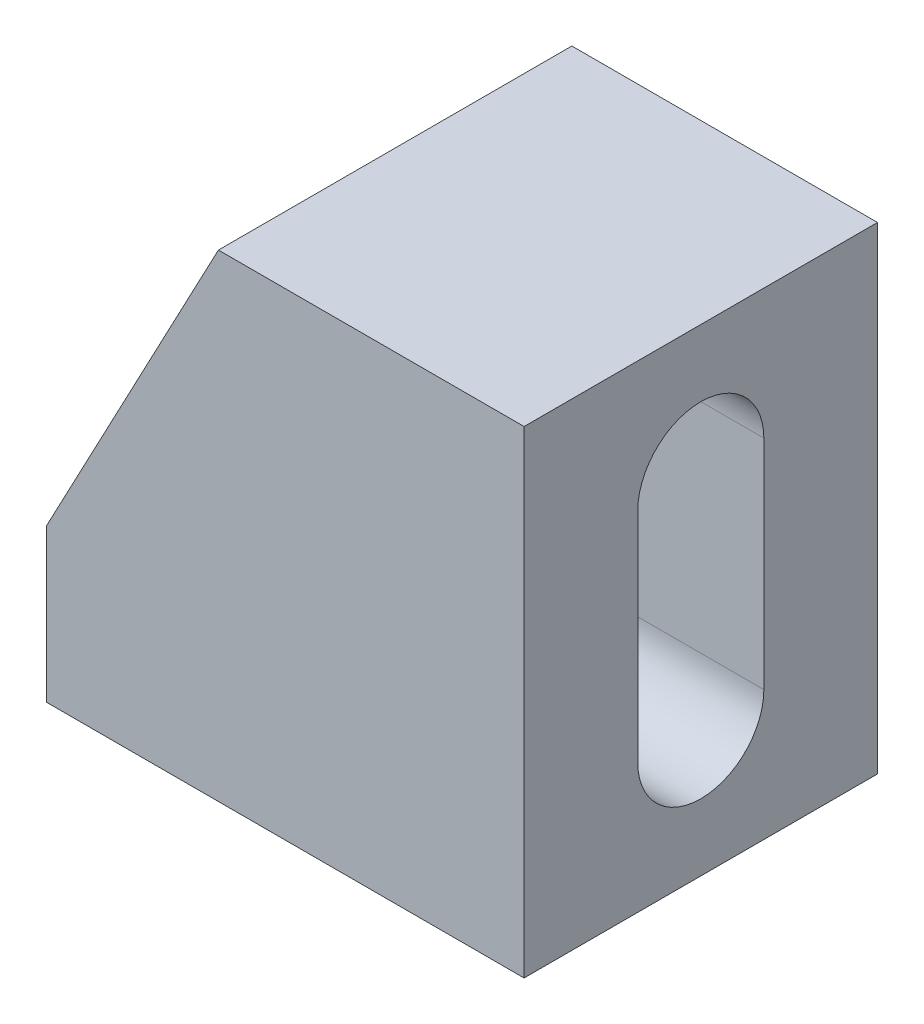
ISO-10303-21;
HEADER;
FILE_DESCRIPTION(('STEP AP214'),'2;1');
FILE_NAME('part.step','',(''),(''),'','','');
FILE_SCHEMA(('AUTOMOTIVE_DESIGN { 1 0 10303 214 1 1 1 1 }'));
ENDSEC;
DATA;
#1=APPLICATION_CONTEXT('core data for automotive mechanical design processes');
#2=APPLICATION_PROTOCOL_DEFINITION('international standard','automotive_design',2000,#1);
#3=PRODUCT_CONTEXT('',#1,'mechanical');
#4=PRODUCT('Part','Part','',(#3));
#5=PRODUCT_RELATED_PRODUCT_CATEGORY('part','',(#4));
#6=PRODUCT_DEFINITION_FORMATION('','',#4);
#7=PRODUCT_DEFINITION_CONTEXT('part definition',#1,'design');
#8=PRODUCT_DEFINITION('design','',#6,#7);
#9=PRODUCT_DEFINITION_SHAPE('','',#8);
#10=(LENGTH_UNIT() NAMED_UNIT(*) SI_UNIT(.MILLI.,.METRE.));
#11=(NAMED_UNIT(*) PLANE_ANGLE_UNIT() SI_UNIT($,.RADIAN.));
#12=(NAMED_UNIT(*) SI_UNIT($,.STERADIAN.) SOLID_ANGLE_UNIT());
#13=UNCERTAINTY_MEASURE_WITH_UNIT(LENGTH_MEASURE(1.E-05),#10,'distance_accuracy_value','');
#14=(GEOMETRIC_REPRESENTATION_CONTEXT(3) GLOBAL_UNCERTAINTY_ASSIGNED_CONTEXT((#13)) GLOBAL_UNIT_ASSIGNED_CONTEXT((#10,
#11,#12)) REPRESENTATION_CONTEXT('',''));
#15=CARTESIAN_POINT('',(0.,0.,0.));
#16=DIRECTION('',(0.,0.,1.));
#17=DIRECTION('',(1.,0.,0.));
#18=AXIS2_PLACEMENT_3D('',#15,#16,#17);
#19=CARTESIAN_POINT('',(25.,25.,9.25));
#20=DIRECTION('',(-1.,0.,0.));
#21=DIRECTION('',(0.,-1.,0.));
#22=AXIS2_PLACEMENT_3D('',#19,#20,#21);
#23=PLANE('',#22);
#24=DIRECTION('',(0.,1.,0.));
#25=VECTOR('',#24,1.);
#26=CARTESIAN_POINT('',(25.,25.,-9.25));
#27=LINE('',#26,#25);
#28=CARTESIAN_POINT('',(25.,0.,-9.25));
#29=VERTEX_POINT('',#28);
#30=CARTESIAN_POINT('',(25.,25.,-9.25));
#31=VERTEX_POINT('',#30);
#32=EDGE_CURVE('E234',#29,#31,#27,.T.);
#33=ORIENTED_EDGE('',*,*,#32,.T.);
#34=DIRECTION('',(0.,0.,-1.));
#35=VECTOR('',#34,1.);
#36=CARTESIAN_POINT('',(25.,25.,9.25));
#37=LINE('',#36,#35);
#38=CARTESIAN_POINT('',(25.,25.,9.25));
#39=VERTEX_POINT('',#38);
#40=EDGE_CURVE('E250',#39,#31,#37,.T.);
#41=ORIENTED_EDGE('',*,*,#40,.F.);
#42=DIRECTION('',(0.,1.,0.));
#43=VECTOR('',#42,1.);
#44=CARTESIAN_POINT('',(25.,25.,9.25));
#45=LINE('',#44,#43);
#46=CARTESIAN_POINT('',(25.,0.,9.25));
#47=VERTEX_POINT('',#46);
#48=EDGE_CURVE('E222',#47,#39,#45,.T.);
#49=ORIENTED_EDGE('',*,*,#48,.F.);
#50=DIRECTION('',(0.,0.,-1.));
#51=VECTOR('',#50,1.);
#52=CARTESIAN_POINT('',(25.,0.,9.25));
#53=LINE('',#52,#51);
#54=EDGE_CURVE('E253',#47,#29,#53,.T.);
#55=ORIENTED_EDGE('',*,*,#54,.T.);
#56=EDGE_LOOP('',(#33,#41,#49,#55));
#57=FACE_BOUND('',#56,.T.);
#58=CARTESIAN_POINT('',(25.,18.2,0.));
#59=DIRECTION('',(1.,0.,0.));
#60=DIRECTION('',(0.,0.,-1.));
#61=AXIS2_PLACEMENT_3D('',#58,#59,#60);
#62=CIRCLE('',#61,3.3);
#63=CARTESIAN_POINT('',(25.,18.2,-3.30000000000003));
#64=VERTEX_POINT('',#63);
#65=CARTESIAN_POINT('',(25.,18.2,3.3));
#66=VERTEX_POINT('',#65);
#67=EDGE_CURVE('E211',#64,#66,#62,.T.);
#68=ORIENTED_EDGE('',*,*,#67,.F.);
#69=DIRECTION('',(0.,1.,0.));
#70=VECTOR('',#69,1.);
#71=CARTESIAN_POINT('',(25.,6.8,-3.30000000000003));
#72=LINE('',#71,#70);
#73=CARTESIAN_POINT('',(25.,6.8,-3.3));
#74=VERTEX_POINT('',#73);
#75=EDGE_CURVE('E195',#74,#64,#72,.T.);
#76=ORIENTED_EDGE('',*,*,#75,.F.);
#77=CARTESIAN_POINT('',(25.,6.8,0.));
#78=DIRECTION('',(1.,0.,0.));
#79=DIRECTION('',(0.,0.,-1.));
#80=AXIS2_PLACEMENT_3D('',#77,#78,#79);
#81=CIRCLE('',#80,3.3);
#82=CARTESIAN_POINT('',(25.,6.8,3.3));
#83=VERTEX_POINT('',#82);
#84=EDGE_CURVE('E199',#83,#74,#81,.T.);
#85=ORIENTED_EDGE('',*,*,#84,.F.);
#86=DIRECTION('',(0.,1.,0.));
#87=VECTOR('',#86,1.);
#88=CARTESIAN_POINT('',(25.,6.8,3.3));
#89=LINE('',#88,#87);
#90=EDGE_CURVE('E206',#83,#66,#89,.T.);
#91=ORIENTED_EDGE('',*,*,#90,.T.);
#92=EDGE_LOOP('',(#68,#76,#85,#91));
#93=FACE_BOUND('',#92,.T.);
#94=ADVANCED_FACE('F110',(#57,#93),#23,.F.);
#95=CARTESIAN_POINT('',(25.,0.,9.25));
#96=DIRECTION('',(0.,1.,0.));
#97=DIRECTION('',(-1.,0.,0.));
#98=AXIS2_PLACEMENT_3D('',#95,#96,#97);
#99=PLANE('',#98);
#100=DIRECTION('',(1.,0.,0.));
#101=VECTOR('',#100,1.);
#102=CARTESIAN_POINT('',(25.,0.,-9.25));
#103=LINE('',#102,#101);
#104=CARTESIAN_POINT('',(0.,0.,-9.25));
#105=VERTEX_POINT('',#104);
#106=EDGE_CURVE('E218',#105,#29,#103,.T.);
#107=ORIENTED_EDGE('',*,*,#106,.T.);
#108=ORIENTED_EDGE('',*,*,#54,.F.);
#109=DIRECTION('',(1.,0.,0.));
#110=VECTOR('',#109,1.);
#111=CARTESIAN_POINT('',(25.,0.,9.25));
#112=LINE('',#111,#110);
#113=CARTESIAN_POINT('',(0.,0.,9.25));
#114=VERTEX_POINT('',#113);
#115=EDGE_CURVE('E219',#114,#47,#112,.T.);
#116=ORIENTED_EDGE('',*,*,#115,.F.);
#117=DIRECTION('',(0.,0.,-1.));
#118=VECTOR('',#117,1.);
#119=CARTESIAN_POINT('',(0.,0.,9.25));
#120=LINE('',#119,#118);
#121=EDGE_CURVE('E231',#114,#105,#120,.T.);
#122=ORIENTED_EDGE('',*,*,#121,.T.);
#123=EDGE_LOOP('',(#107,#108,#116,#122));
#124=FACE_BOUND('',#123,.T.);
#125=ADVANCED_FACE('F112',(#124),#99,.F.);
#126=CARTESIAN_POINT('',(9.,25.,9.25));
#127=DIRECTION('',(0.,-1.,0.));
#128=DIRECTION('',(1.,0.,0.));
#129=AXIS2_PLACEMENT_3D('',#126,#127,#128);
#130=PLANE('',#129);
#131=DIRECTION('',(-1.,0.,0.));
#132=VECTOR('',#131,1.);
#133=CARTESIAN_POINT('',(9.,25.,-9.25));
#134=LINE('',#133,#132);
#135=CARTESIAN_POINT('',(9.,25.,-9.25));
#136=VERTEX_POINT('',#135);
#137=EDGE_CURVE('E236',#31,#136,#134,.T.);
#138=ORIENTED_EDGE('',*,*,#137,.T.);
#139=DIRECTION('',(0.,0.,-1.));
#140=VECTOR('',#139,1.);
#141=CARTESIAN_POINT('',(9.,25.,9.25));
#142=LINE('',#141,#140);
#143=CARTESIAN_POINT('',(9.,25.,9.25));
#144=VERTEX_POINT('',#143);
#145=EDGE_CURVE('E247',#144,#136,#142,.T.);
#146=ORIENTED_EDGE('',*,*,#145,.F.);
#147=DIRECTION('',(-1.,0.,0.));
#148=VECTOR('',#147,1.);
#149=CARTESIAN_POINT('',(9.,25.,9.25));
#150=LINE('',#149,#148);
#151=EDGE_CURVE('E225',#39,#144,#150,.T.);
#152=ORIENTED_EDGE('',*,*,#151,.F.);
#153=ORIENTED_EDGE('',*,*,#40,.T.);
#154=EDGE_LOOP('',(#138,#146,#152,#153));
#155=FACE_BOUND('',#154,.T.);
#156=ADVANCED_FACE('F286',(#155),#130,.F.);
#157=CARTESIAN_POINT('',(0.,8.,9.25));
#158=DIRECTION('',(0.883787916347062,-0.467887720419033,0.));
#159=DIRECTION('',(0.467887720419033,0.883787916347062,0.));
#160=AXIS2_PLACEMENT_3D('',#157,#158,#159);
#161=PLANE('',#160);
#162=CARTESIAN_POINT('',(5.4,18.2,0.));
#163=DIRECTION('',(0.883787916347062,-0.467887720419033,0.));
#164=DIRECTION('',(0.467887720419033,0.883787916347062,0.));
#165=AXIS2_PLACEMENT_3D('',#162,#163,#164);
#166=ELLIPSE('',#165,3.73392749432443,3.3);
#167=CARTESIAN_POINT('',(5.4,18.2,-3.3));
#168=VERTEX_POINT('',#167);
#169=CARTESIAN_POINT('',(5.4,18.2,3.3));
#170=VERTEX_POINT('',#169);
#171=EDGE_CURVE('E118',#168,#170,#166,.T.);
#172=ORIENTED_EDGE('',*,*,#171,.T.);
#173=DIRECTION('',(-0.467887720419033,-0.883787916347062,0.));
#174=VECTOR('',#173,1.);
#175=CARTESIAN_POINT('',(0.,8.,3.29999999999999));
#176=LINE('',#175,#174);
#177=CARTESIAN_POINT('',(0.,8.,3.29999999999999));
#178=VERTEX_POINT('',#177);
#179=EDGE_CURVE('E13',#170,#178,#176,.T.);
#180=ORIENTED_EDGE('',*,*,#179,.T.);
#181=DIRECTION('',(0.,0.,-1.));
#182=VECTOR('',#181,1.);
#183=CARTESIAN_POINT('',(0.,8.,9.25));
#184=LINE('',#183,#182);
#185=CARTESIAN_POINT('',(0.,8.,9.25));
#186=VERTEX_POINT('',#185);
#187=EDGE_CURVE('E245',#186,#178,#184,.T.);
#188=ORIENTED_EDGE('',*,*,#187,.F.);
#189=DIRECTION('',(-0.467887720419033,-0.883787916347062,0.));
#190=VECTOR('',#189,1.);
#191=CARTESIAN_POINT('',(0.,8.,9.25));
#192=LINE('',#191,#190);
#193=EDGE_CURVE('E227',#144,#186,#192,.T.);
#194=ORIENTED_EDGE('',*,*,#193,.F.);
#195=ORIENTED_EDGE('',*,*,#145,.T.);
#196=DIRECTION('',(-0.467887720419033,-0.883787916347062,0.));
#197=VECTOR('',#196,1.);
#198=CARTESIAN_POINT('',(0.,8.,-9.25));
#199=LINE('',#198,#197);
#200=CARTESIAN_POINT('',(0.,8.,-9.25));
#201=VERTEX_POINT('',#200);
#202=EDGE_CURVE('E238',#136,#201,#199,.T.);
#203=ORIENTED_EDGE('',*,*,#202,.T.);
#204=CARTESIAN_POINT('',(0.,8.,-3.29999999999999));
#205=VERTEX_POINT('',#204);
#206=EDGE_CURVE('E244',#205,#201,#184,.T.);
#207=ORIENTED_EDGE('',*,*,#206,.F.);
#208=DIRECTION('',(0.467887720419033,0.883787916347062,0.));
#209=VECTOR('',#208,1.);
#210=CARTESIAN_POINT('',(0.,8.,-3.3));
#211=LINE('',#210,#209);
#212=EDGE_CURVE('E191',#205,#168,#211,.T.);
#213=ORIENTED_EDGE('',*,*,#212,.T.);
#214=EDGE_LOOP('',(#172,#180,#188,#194,#195,#203,#207,#213));
#215=FACE_BOUND('',#214,.T.);
#216=ADVANCED_FACE('F258',(#215),#161,.F.);
#217=CARTESIAN_POINT('',(0.,0.,9.25));
#218=DIRECTION('',(1.,0.,0.));
#219=DIRECTION('',(0.,0.,-1.));
#220=AXIS2_PLACEMENT_3D('',#217,#218,#219);
#221=PLANE('',#220);
#222=CARTESIAN_POINT('',(0.,6.8,0.));
#223=DIRECTION('',(1.,0.,0.));
#224=DIRECTION('',(0.,0.,-1.));
#225=AXIS2_PLACEMENT_3D('',#222,#223,#224);
#226=CIRCLE('',#225,3.29999999999999);
#227=CARTESIAN_POINT('',(0.,6.8,3.29999999999999));
#228=VERTEX_POINT('',#227);
#229=CARTESIAN_POINT('',(0.,6.79999999999999,-3.3));
#230=VERTEX_POINT('',#229);
#231=EDGE_CURVE('E130',#228,#230,#226,.T.);
#232=ORIENTED_EDGE('',*,*,#231,.T.);
#233=DIRECTION('',(0.,1.,0.));
#234=VECTOR('',#233,1.);
#235=CARTESIAN_POINT('',(0.,6.79999999999999,-3.3));
#236=LINE('',#235,#234);
#237=EDGE_CURVE('E186',#230,#205,#236,.T.);
#238=ORIENTED_EDGE('',*,*,#237,.T.);
#239=ORIENTED_EDGE('',*,*,#206,.T.);
#240=DIRECTION('',(0.,-1.,0.));
#241=VECTOR('',#240,1.);
#242=CARTESIAN_POINT('',(0.,0.,-9.25));
#243=LINE('',#242,#241);
#244=EDGE_CURVE('E223',#201,#105,#243,.T.);
#245=ORIENTED_EDGE('',*,*,#244,.T.);
#246=ORIENTED_EDGE('',*,*,#121,.F.);
#247=DIRECTION('',(0.,-1.,0.));
#248=VECTOR('',#247,1.);
#249=CARTESIAN_POINT('',(0.,0.,9.25));
#250=LINE('',#249,#248);
#251=EDGE_CURVE('E229',#186,#114,#250,.T.);
#252=ORIENTED_EDGE('',*,*,#251,.F.);
#253=ORIENTED_EDGE('',*,*,#187,.T.);
#254=DIRECTION('',(0.,1.,0.));
#255=VECTOR('',#254,1.);
#256=CARTESIAN_POINT('',(0.,6.8,3.29999999999999));
#257=LINE('',#256,#255);
#258=EDGE_CURVE('E194',#228,#178,#257,.T.);
#259=ORIENTED_EDGE('',*,*,#258,.F.);
#260=EDGE_LOOP('',(#232,#238,#239,#245,#246,#252,#253,#259));
#261=FACE_BOUND('',#260,.T.);
#262=ADVANCED_FACE('F203',(#261),#221,.F.);
#263=CARTESIAN_POINT('',(0.,0.,9.25));
#264=DIRECTION('',(0.,0.,-1.));
#265=DIRECTION('',(-1.,0.,0.));
#266=AXIS2_PLACEMENT_3D('',#263,#264,#265);
#267=PLANE('',#266);
#268=ORIENTED_EDGE('',*,*,#115,.T.);
#269=ORIENTED_EDGE('',*,*,#48,.T.);
#270=ORIENTED_EDGE('',*,*,#151,.T.);
#271=ORIENTED_EDGE('',*,*,#193,.T.);
#272=ORIENTED_EDGE('',*,*,#251,.T.);
#273=EDGE_LOOP('',(#268,#269,#270,#271,#272));
#274=FACE_BOUND('',#273,.T.);
#275=ADVANCED_FACE('F296',(#274),#267,.F.);
#276=CARTESIAN_POINT('',(0.,0.,-9.25));
#277=DIRECTION('',(0.,0.,-1.));
#278=DIRECTION('',(-1.,0.,0.));
#279=AXIS2_PLACEMENT_3D('',#276,#277,#278);
#280=PLANE('',#279);
#281=ORIENTED_EDGE('',*,*,#106,.F.);
#282=ORIENTED_EDGE('',*,*,#244,.F.);
#283=ORIENTED_EDGE('',*,*,#202,.F.);
#284=ORIENTED_EDGE('',*,*,#137,.F.);
#285=ORIENTED_EDGE('',*,*,#32,.F.);
#286=EDGE_LOOP('',(#281,#282,#283,#284,#285));
#287=FACE_BOUND('',#286,.T.);
#288=ADVANCED_FACE('F278',(#287),#280,.T.);
#289=CARTESIAN_POINT('',(25.,18.2,0.));
#290=DIRECTION('',(1.,0.,0.));
#291=DIRECTION('',(0.,0.,-1.));
#292=AXIS2_PLACEMENT_3D('',#289,#290,#291);
#293=CYLINDRICAL_SURFACE('',#292,3.3);
#294=DIRECTION('',(1.,0.,0.));
#295=VECTOR('',#294,1.);
#296=CARTESIAN_POINT('',(25.,18.2,-3.29999999999999));
#297=LINE('',#296,#295);
#298=EDGE_CURVE('E216',#64,#168,#297,.F.);
#299=ORIENTED_EDGE('',*,*,#298,.F.);
#300=ORIENTED_EDGE('',*,*,#67,.T.);
#301=DIRECTION('',(1.,0.,0.));
#302=VECTOR('',#301,1.);
#303=CARTESIAN_POINT('',(25.,18.2,3.3));
#304=LINE('',#303,#302);
#305=EDGE_CURVE('E214',#170,#66,#304,.T.);
#306=ORIENTED_EDGE('',*,*,#305,.F.);
#307=ORIENTED_EDGE('',*,*,#171,.F.);
#308=EDGE_LOOP('',(#299,#300,#306,#307));
#309=FACE_BOUND('',#308,.T.);
#310=ADVANCED_FACE('F263',(#309),#293,.F.);
#311=CARTESIAN_POINT('',(25.,6.8,3.29999999999999));
#312=DIRECTION('',(0.,0.,1.));
#313=DIRECTION('',(0.,-1.,0.));
#314=AXIS2_PLACEMENT_3D('',#311,#312,#313);
#315=PLANE('',#314);
#316=ORIENTED_EDGE('',*,*,#305,.T.);
#317=ORIENTED_EDGE('',*,*,#90,.F.);
#318=DIRECTION('',(1.,0.,0.));
#319=VECTOR('',#318,1.);
#320=CARTESIAN_POINT('',(25.,6.8,3.29999999999999));
#321=LINE('',#320,#319);
#322=EDGE_CURVE('E125',#83,#228,#321,.F.);
#323=ORIENTED_EDGE('',*,*,#322,.T.);
#324=ORIENTED_EDGE('',*,*,#258,.T.);
#325=ORIENTED_EDGE('',*,*,#179,.F.);
#326=EDGE_LOOP('',(#316,#317,#323,#324,#325));
#327=FACE_BOUND('',#326,.T.);
#328=ADVANCED_FACE('F270',(#327),#315,.F.);
#329=CARTESIAN_POINT('',(25.,6.8,-3.3));
#330=DIRECTION('',(0.,0.,-1.));
#331=DIRECTION('',(0.,1.,0.));
#332=AXIS2_PLACEMENT_3D('',#329,#330,#331);
#333=PLANE('',#332);
#334=ORIENTED_EDGE('',*,*,#237,.F.);
#335=DIRECTION('',(1.,0.,0.));
#336=VECTOR('',#335,1.);
#337=CARTESIAN_POINT('',(25.,6.8,-3.3));
#338=LINE('',#337,#336);
#339=EDGE_CURVE('E188',#230,#74,#338,.T.);
#340=ORIENTED_EDGE('',*,*,#339,.T.);
#341=ORIENTED_EDGE('',*,*,#75,.T.);
#342=ORIENTED_EDGE('',*,*,#298,.T.);
#343=ORIENTED_EDGE('',*,*,#212,.F.);
#344=EDGE_LOOP('',(#334,#340,#341,#342,#343));
#345=FACE_BOUND('',#344,.T.);
#346=ADVANCED_FACE('F187',(#345),#333,.F.);
#347=CARTESIAN_POINT('',(25.,6.8,0.));
#348=DIRECTION('',(1.,0.,0.));
#349=DIRECTION('',(0.,0.,-1.));
#350=AXIS2_PLACEMENT_3D('',#347,#348,#349);
#351=CYLINDRICAL_SURFACE('',#350,3.3);
#352=ORIENTED_EDGE('',*,*,#84,.T.);
#353=ORIENTED_EDGE('',*,*,#339,.F.);
#354=ORIENTED_EDGE('',*,*,#231,.F.);
#355=ORIENTED_EDGE('',*,*,#322,.F.);
#356=EDGE_LOOP('',(#352,#353,#354,#355));
#357=FACE_BOUND('',#356,.T.);
#358=ADVANCED_FACE('F197',(#357),#351,.F.);
#359=CLOSED_SHELL('',(#94,#125,#156,#216,#262,#275,#288,#310,#328,#346,#358));
#360=MANIFOLD_SOLID_BREP('B2',#359);
#361=ADVANCED_BREP_SHAPE_REPRESENTATION('',(#18,#360),#14);
#362=SHAPE_DEFINITION_REPRESENTATION(#9,#361);
ENDSEC;
END-ISO-10303-21;
